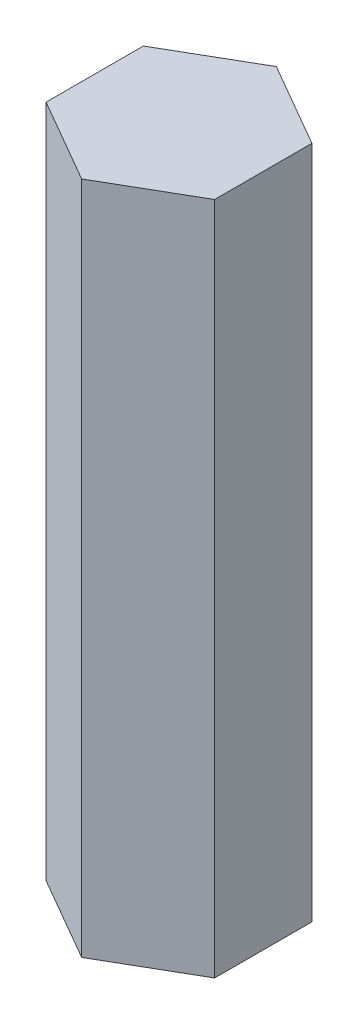
ISO-10303-21;
HEADER;
FILE_DESCRIPTION(('STEP AP214'),'2;1');
FILE_NAME('part.step','',(''),(''),'','','');
FILE_SCHEMA(('AUTOMOTIVE_DESIGN { 1 0 10303 214 1 1 1 1 }'));
ENDSEC;
DATA;
#1=APPLICATION_CONTEXT('core data for automotive mechanical design processes');
#2=APPLICATION_PROTOCOL_DEFINITION('international standard','automotive_design',2000,#1);
#3=PRODUCT_CONTEXT('',#1,'mechanical');
#4=PRODUCT('Part','Part','',(#3));
#5=PRODUCT_RELATED_PRODUCT_CATEGORY('part','',(#4));
#6=PRODUCT_DEFINITION_FORMATION('','',#4);
#7=PRODUCT_DEFINITION_CONTEXT('part definition',#1,'design');
#8=PRODUCT_DEFINITION('design','',#6,#7);
#9=PRODUCT_DEFINITION_SHAPE('','',#8);
#10=(LENGTH_UNIT() NAMED_UNIT(*) SI_UNIT(.MILLI.,.METRE.));
#11=(NAMED_UNIT(*) PLANE_ANGLE_UNIT() SI_UNIT($,.RADIAN.));
#12=(NAMED_UNIT(*) SI_UNIT($,.STERADIAN.) SOLID_ANGLE_UNIT());
#13=UNCERTAINTY_MEASURE_WITH_UNIT(LENGTH_MEASURE(1.E-05),#10,'distance_accuracy_value','');
#14=(GEOMETRIC_REPRESENTATION_CONTEXT(3) GLOBAL_UNCERTAINTY_ASSIGNED_CONTEXT((#13)) GLOBAL_UNIT_ASSIGNED_CONTEXT((#10,
#11,#12)) REPRESENTATION_CONTEXT('',''));
#15=CARTESIAN_POINT('',(0.,0.,0.));
#16=DIRECTION('',(0.,0.,1.));
#17=DIRECTION('',(1.,0.,0.));
#18=AXIS2_PLACEMENT_3D('',#15,#16,#17);
#19=CARTESIAN_POINT('',(2.5,0.,-1.443375672974));
#20=DIRECTION('',(0.500000000000017,0.,-0.866025403784429));
#21=DIRECTION('',(0.,-1.,0.));
#22=AXIS2_PLACEMENT_3D('',#19,#20,#21);
#23=PLANE('',#22);
#24=DIRECTION('',(0.,1.,0.));
#25=VECTOR('',#24,1.);
#26=CARTESIAN_POINT('',(0.,0.,-2.886751345958));
#27=LINE('',#26,#25);
#28=CARTESIAN_POINT('',(0.,0.,-2.886751345948));
#29=VERTEX_POINT('',#28);
#30=CARTESIAN_POINT('',(0.,20.,-2.886751345948));
#31=VERTEX_POINT('',#30);
#32=EDGE_CURVE('E11',#29,#31,#27,.T.);
#33=ORIENTED_EDGE('',*,*,#32,.T.);
#34=DIRECTION('',(-0.866025403784448,0.,-0.499999999999983));
#35=VECTOR('',#34,1.);
#36=CARTESIAN_POINT('',(2.5,20.,-1.443375672974));
#37=LINE('',#36,#35);
#38=CARTESIAN_POINT('',(2.5,20.,-1.443375672974));
#39=VERTEX_POINT('',#38);
#40=EDGE_CURVE('E145',#39,#31,#37,.T.);
#41=ORIENTED_EDGE('',*,*,#40,.F.);
#42=DIRECTION('',(0.,1.,0.));
#43=VECTOR('',#42,1.);
#44=CARTESIAN_POINT('',(2.50000000001,0.,-1.443375672984));
#45=LINE('',#44,#43);
#46=CARTESIAN_POINT('',(2.5,0.,-1.443375672974));
#47=VERTEX_POINT('',#46);
#48=EDGE_CURVE('E81',#47,#39,#45,.T.);
#49=ORIENTED_EDGE('',*,*,#48,.F.);
#50=DIRECTION('',(-0.866025403783795,0.,-0.500000000001115));
#51=VECTOR('',#50,1.);
#52=CARTESIAN_POINT('',(2.50000000001,0.,-1.443375672984));
#53=LINE('',#52,#51);
#54=EDGE_CURVE('E61',#47,#29,#53,.T.);
#55=ORIENTED_EDGE('',*,*,#54,.T.);
#56=EDGE_LOOP('',(#33,#41,#49,#55));
#57=FACE_BOUND('',#56,.T.);
#58=ADVANCED_FACE('F52',(#57),#23,.T.);
#59=CARTESIAN_POINT('',(2.5,0.,1.443375672974));
#60=DIRECTION('',(1.,0.,0.));
#61=DIRECTION('',(0.,1.,0.));
#62=AXIS2_PLACEMENT_3D('',#59,#60,#61);
#63=PLANE('',#62);
#64=ORIENTED_EDGE('',*,*,#48,.T.);
#65=DIRECTION('',(0.,0.,-1.));
#66=VECTOR('',#65,1.);
#67=CARTESIAN_POINT('',(2.5,20.,1.443375672974));
#68=LINE('',#67,#66);
#69=CARTESIAN_POINT('',(2.5,20.,1.443375672974));
#70=VERTEX_POINT('',#69);
#71=EDGE_CURVE('E133',#70,#39,#68,.T.);
#72=ORIENTED_EDGE('',*,*,#71,.F.);
#73=DIRECTION('',(0.,1.,0.));
#74=VECTOR('',#73,1.);
#75=CARTESIAN_POINT('',(2.50000000001,0.,1.443375672984));
#76=LINE('',#75,#74);
#77=CARTESIAN_POINT('',(2.5,0.,1.443375672974));
#78=VERTEX_POINT('',#77);
#79=EDGE_CURVE('E143',#78,#70,#76,.T.);
#80=ORIENTED_EDGE('',*,*,#79,.F.);
#81=DIRECTION('',(0.,0.,-1.));
#82=VECTOR('',#81,1.);
#83=CARTESIAN_POINT('',(2.50000000001,0.,1.443375672984));
#84=LINE('',#83,#82);
#85=EDGE_CURVE('E166',#78,#47,#84,.T.);
#86=ORIENTED_EDGE('',*,*,#85,.T.);
#87=EDGE_LOOP('',(#64,#72,#80,#86));
#88=FACE_BOUND('',#87,.T.);
#89=ADVANCED_FACE('F141',(#88),#63,.T.);
#90=CARTESIAN_POINT('',(0.,0.,-2.886751345948));
#91=DIRECTION('',(-0.500000000000017,0.,-0.866025403784429));
#92=DIRECTION('',(-0.866025403784429,0.,0.500000000000017));
#93=AXIS2_PLACEMENT_3D('',#90,#91,#92);
#94=PLANE('',#93);
#95=DIRECTION('',(0.,1.,0.));
#96=VECTOR('',#95,1.);
#97=CARTESIAN_POINT('',(-2.50000000001,0.,-1.443375672984));
#98=LINE('',#97,#96);
#99=CARTESIAN_POINT('',(-2.5,0.,-1.443375672974));
#100=VERTEX_POINT('',#99);
#101=CARTESIAN_POINT('',(-2.50000000001,20.,-1.443375672984));
#102=VERTEX_POINT('',#101);
#103=EDGE_CURVE('E177',#100,#102,#98,.T.);
#104=ORIENTED_EDGE('',*,*,#103,.T.);
#105=DIRECTION('',(-0.866025403784448,0.,0.499999999999983));
#106=VECTOR('',#105,1.);
#107=CARTESIAN_POINT('',(0.,20.,-2.886751345948));
#108=LINE('',#107,#106);
#109=EDGE_CURVE('E69',#31,#102,#108,.T.);
#110=ORIENTED_EDGE('',*,*,#109,.F.);
#111=ORIENTED_EDGE('',*,*,#32,.F.);
#112=DIRECTION('',(-0.866025403783795,0.,0.500000000001115));
#113=VECTOR('',#112,1.);
#114=CARTESIAN_POINT('',(0.,0.,-2.886751345958));
#115=LINE('',#114,#113);
#116=EDGE_CURVE('E55',#29,#100,#115,.T.);
#117=ORIENTED_EDGE('',*,*,#116,.T.);
#118=EDGE_LOOP('',(#104,#110,#111,#117));
#119=FACE_BOUND('',#118,.T.);
#120=ADVANCED_FACE('F198',(#119),#94,.T.);
#121=CARTESIAN_POINT('',(0.,0.,2.886751345948));
#122=DIRECTION('',(0.500000000000017,0.,0.866025403784429));
#123=DIRECTION('',(0.,-1.,0.));
#124=AXIS2_PLACEMENT_3D('',#121,#122,#123);
#125=PLANE('',#124);
#126=ORIENTED_EDGE('',*,*,#79,.T.);
#127=DIRECTION('',(0.866025403784448,0.,-0.499999999999983));
#128=VECTOR('',#127,1.);
#129=CARTESIAN_POINT('',(0.,20.,2.886751345948));
#130=LINE('',#129,#128);
#131=CARTESIAN_POINT('',(0.,20.,2.886751345948));
#132=VERTEX_POINT('',#131);
#133=EDGE_CURVE('E130',#132,#70,#130,.T.);
#134=ORIENTED_EDGE('',*,*,#133,.F.);
#135=DIRECTION('',(0.,1.,0.));
#136=VECTOR('',#135,1.);
#137=CARTESIAN_POINT('',(0.,0.,2.886751345958));
#138=LINE('',#137,#136);
#139=CARTESIAN_POINT('',(0.,0.,2.886751345948));
#140=VERTEX_POINT('',#139);
#141=EDGE_CURVE('E158',#140,#132,#138,.T.);
#142=ORIENTED_EDGE('',*,*,#141,.F.);
#143=DIRECTION('',(0.866025403783795,0.,-0.500000000001115));
#144=VECTOR('',#143,1.);
#145=CARTESIAN_POINT('',(0.,0.,2.886751345958));
#146=LINE('',#145,#144);
#147=EDGE_CURVE('E149',#140,#78,#146,.T.);
#148=ORIENTED_EDGE('',*,*,#147,.T.);
#149=EDGE_LOOP('',(#126,#134,#142,#148));
#150=FACE_BOUND('',#149,.T.);
#151=ADVANCED_FACE('F148',(#150),#125,.T.);
#152=CARTESIAN_POINT('',(-2.5,0.,1.443375672974));
#153=DIRECTION('',(-0.500000000000017,0.,0.866025403784429));
#154=DIRECTION('',(0.,1.,0.));
#155=AXIS2_PLACEMENT_3D('',#152,#153,#154);
#156=PLANE('',#155);
#157=ORIENTED_EDGE('',*,*,#141,.T.);
#158=DIRECTION('',(0.866025403784448,0.,0.499999999999983));
#159=VECTOR('',#158,1.);
#160=CARTESIAN_POINT('',(-2.5,20.,1.443375672974));
#161=LINE('',#160,#159);
#162=CARTESIAN_POINT('',(-2.5,20.,1.443375672974));
#163=VERTEX_POINT('',#162);
#164=EDGE_CURVE('E135',#163,#132,#161,.T.);
#165=ORIENTED_EDGE('',*,*,#164,.F.);
#166=DIRECTION('',(0.,1.,0.));
#167=VECTOR('',#166,1.);
#168=CARTESIAN_POINT('',(-2.50000000001,0.,1.443375672984));
#169=LINE('',#168,#167);
#170=CARTESIAN_POINT('',(-2.5,0.,1.443375672974));
#171=VERTEX_POINT('',#170);
#172=EDGE_CURVE('E169',#171,#163,#169,.T.);
#173=ORIENTED_EDGE('',*,*,#172,.F.);
#174=DIRECTION('',(0.866025403783795,0.,0.500000000001115));
#175=VECTOR('',#174,1.);
#176=CARTESIAN_POINT('',(-2.50000000001,0.,1.443375672984));
#177=LINE('',#176,#175);
#178=EDGE_CURVE('E114',#171,#140,#177,.T.);
#179=ORIENTED_EDGE('',*,*,#178,.T.);
#180=EDGE_LOOP('',(#157,#165,#173,#179));
#181=FACE_BOUND('',#180,.T.);
#182=ADVANCED_FACE('F189',(#181),#156,.T.);
#183=CARTESIAN_POINT('',(-2.5,0.,-1.443375672974));
#184=DIRECTION('',(-1.,0.,0.));
#185=DIRECTION('',(0.,0.,1.));
#186=AXIS2_PLACEMENT_3D('',#183,#184,#185);
#187=PLANE('',#186);
#188=ORIENTED_EDGE('',*,*,#172,.T.);
#189=DIRECTION('',(0.,0.,1.));
#190=VECTOR('',#189,1.);
#191=CARTESIAN_POINT('',(-2.5,20.,-1.443375672974));
#192=LINE('',#191,#190);
#193=EDGE_CURVE('E190',#102,#163,#192,.T.);
#194=ORIENTED_EDGE('',*,*,#193,.F.);
#195=ORIENTED_EDGE('',*,*,#103,.F.);
#196=DIRECTION('',(0.,0.,1.));
#197=VECTOR('',#196,1.);
#198=CARTESIAN_POINT('',(-2.50000000001,0.,-1.443375672984));
#199=LINE('',#198,#197);
#200=EDGE_CURVE('E161',#100,#171,#199,.T.);
#201=ORIENTED_EDGE('',*,*,#200,.T.);
#202=EDGE_LOOP('',(#188,#194,#195,#201));
#203=FACE_BOUND('',#202,.T.);
#204=ADVANCED_FACE('F192',(#203),#187,.T.);
#205=CARTESIAN_POINT('',(0.,0.,0.));
#206=DIRECTION('',(0.,1.,0.));
#207=DIRECTION('',(1.,0.,0.));
#208=AXIS2_PLACEMENT_3D('',#205,#206,#207);
#209=PLANE('',#208);
#210=ORIENTED_EDGE('',*,*,#54,.F.);
#211=ORIENTED_EDGE('',*,*,#85,.F.);
#212=ORIENTED_EDGE('',*,*,#147,.F.);
#213=ORIENTED_EDGE('',*,*,#178,.F.);
#214=ORIENTED_EDGE('',*,*,#200,.F.);
#215=ORIENTED_EDGE('',*,*,#116,.F.);
#216=EDGE_LOOP('',(#210,#211,#212,#213,#214,#215));
#217=FACE_BOUND('',#216,.T.);
#218=CARTESIAN_POINT('',(0.,0.,0.));
#219=DIRECTION('',(0.,1.,0.));
#220=DIRECTION('',(-1.,0.,0.));
#221=AXIS2_PLACEMENT_3D('',#218,#219,#220);
#222=CIRCLE('',#221,1.25);
#223=CARTESIAN_POINT('',(-1.25,0.,0.));
#224=VERTEX_POINT('',#223);
#225=EDGE_CURVE('E151',#224,#224,#222,.T.);
#226=ORIENTED_EDGE('',*,*,#225,.T.);
#227=EDGE_LOOP('',(#226));
#228=FACE_BOUND('',#227,.T.);
#229=ADVANCED_FACE('F196',(#217,#228),#209,.F.);
#230=CARTESIAN_POINT('',(0.,11.28862956247,0.));
#231=DIRECTION('',(0.,-1.,0.));
#232=DIRECTION('',(1.,0.,0.));
#233=AXIS2_PLACEMENT_3D('',#230,#231,#232);
#234=CYLINDRICAL_SURFACE('',#233,1.25);
#235=CARTESIAN_POINT('',(0.,10.00000000001,0.));
#236=DIRECTION('',(0.,1.,0.));
#237=DIRECTION('',(1.,0.,0.));
#238=AXIS2_PLACEMENT_3D('',#235,#236,#237);
#239=CIRCLE('',#238,1.25);
#240=CARTESIAN_POINT('',(1.25,10.00000000001,0.));
#241=VERTEX_POINT('',#240);
#242=EDGE_CURVE('E173',#241,#241,#239,.T.);
#243=ORIENTED_EDGE('',*,*,#242,.T.);
#244=EDGE_LOOP('',(#243));
#245=FACE_BOUND('',#244,.T.);
#246=ORIENTED_EDGE('',*,*,#225,.F.);
#247=EDGE_LOOP('',(#246));
#248=FACE_BOUND('',#247,.T.);
#249=ADVANCED_FACE('F262',(#245,#248),#234,.F.);
#250=CARTESIAN_POINT('',(0.,10.36143298831,0.));
#251=DIRECTION('',(0.,-1.,0.));
#252=DIRECTION('',(-1.,0.,0.));
#253=AXIS2_PLACEMENT_3D('',#250,#251,#252);
#254=CONICAL_SURFACE('',#253,0.6484745,1.0297442587);
#255=ORIENTED_EDGE('',*,*,#242,.F.);
#256=EDGE_LOOP('',(#255));
#257=FACE_BOUND('',#256,.T.);
#258=CARTESIAN_POINT('',(0.,10.75107577378,0.));
#259=VERTEX_POINT('',#258);
#260=VERTEX_LOOP('',#259);
#261=FACE_BOUND('',#260,.T.);
#262=ADVANCED_FACE('F258',(#257,#261),#254,.F.);
#263=CARTESIAN_POINT('',(0.,20.,0.));
#264=DIRECTION('',(0.,1.,0.));
#265=DIRECTION('',(0.,0.,1.));
#266=AXIS2_PLACEMENT_3D('',#263,#264,#265);
#267=PLANE('',#266);
#268=ORIENTED_EDGE('',*,*,#133,.T.);
#269=ORIENTED_EDGE('',*,*,#71,.T.);
#270=ORIENTED_EDGE('',*,*,#40,.T.);
#271=ORIENTED_EDGE('',*,*,#109,.T.);
#272=ORIENTED_EDGE('',*,*,#193,.T.);
#273=ORIENTED_EDGE('',*,*,#164,.T.);
#274=EDGE_LOOP('',(#268,#269,#270,#271,#272,#273));
#275=FACE_BOUND('',#274,.T.);
#276=ADVANCED_FACE('F132',(#275),#267,.T.);
#277=CLOSED_SHELL('',(#58,#89,#120,#151,#182,#204,#229,#249,#262,#276));
#278=MANIFOLD_SOLID_BREP('B2',#277);
#279=ADVANCED_BREP_SHAPE_REPRESENTATION('',(#18,#278),#14);
#280=SHAPE_DEFINITION_REPRESENTATION(#9,#279);
ENDSEC;
END-ISO-10303-21;
